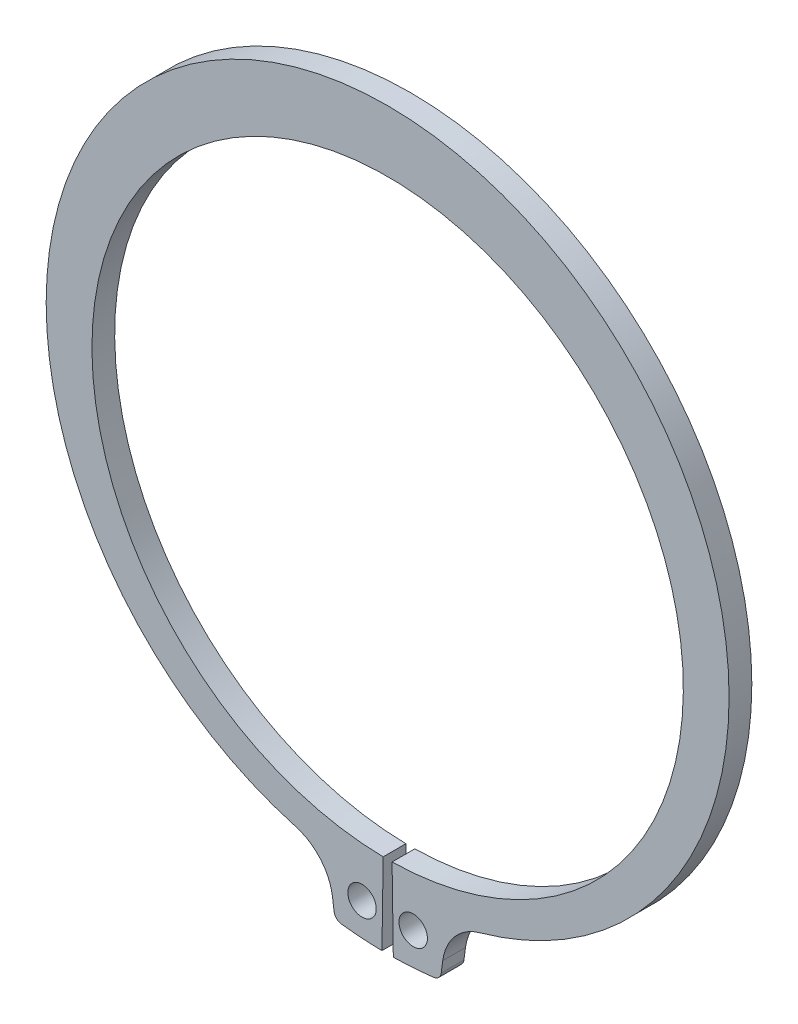
ISO-10303-21;
HEADER;
FILE_DESCRIPTION(('STEP AP214'),'2;1');
FILE_NAME('part.step','',(''),(''),'','','');
FILE_SCHEMA(('AUTOMOTIVE_DESIGN { 1 0 10303 214 1 1 1 1 }'));
ENDSEC;
DATA;
#1=APPLICATION_CONTEXT('core data for automotive mechanical design processes');
#2=APPLICATION_PROTOCOL_DEFINITION('international standard','automotive_design',2000,#1);
#3=PRODUCT_CONTEXT('',#1,'mechanical');
#4=PRODUCT('Part','Part','',(#3));
#5=PRODUCT_RELATED_PRODUCT_CATEGORY('part','',(#4));
#6=PRODUCT_DEFINITION_FORMATION('','',#4);
#7=PRODUCT_DEFINITION_CONTEXT('part definition',#1,'design');
#8=PRODUCT_DEFINITION('design','',#6,#7);
#9=PRODUCT_DEFINITION_SHAPE('','',#8);
#10=(LENGTH_UNIT() NAMED_UNIT(*) SI_UNIT(.MILLI.,.METRE.));
#11=(NAMED_UNIT(*) PLANE_ANGLE_UNIT() SI_UNIT($,.RADIAN.));
#12=(NAMED_UNIT(*) SI_UNIT($,.STERADIAN.) SOLID_ANGLE_UNIT());
#13=UNCERTAINTY_MEASURE_WITH_UNIT(LENGTH_MEASURE(1.E-05),#10,'distance_accuracy_value','');
#14=(GEOMETRIC_REPRESENTATION_CONTEXT(3) GLOBAL_UNCERTAINTY_ASSIGNED_CONTEXT((#13)) GLOBAL_UNIT_ASSIGNED_CONTEXT((#10,
#11,#12)) REPRESENTATION_CONTEXT('',''));
#15=CARTESIAN_POINT('',(0.,0.,0.));
#16=DIRECTION('',(0.,0.,1.));
#17=DIRECTION('',(1.,0.,0.));
#18=AXIS2_PLACEMENT_3D('',#15,#16,#17);
#19=CARTESIAN_POINT('',(0.,0.,-2.));
#20=DIRECTION('',(0.,0.,0.999999999999997));
#21=DIRECTION('',(0.999999999999999,0.,0.));
#22=AXIS2_PLACEMENT_3D('',#19,#20,#21);
#23=CYLINDRICAL_SURFACE('',#22,26.);
#24=CARTESIAN_POINT('',(0.,0.,0.));
#25=DIRECTION('',(0.,0.,-0.999999999999997));
#26=DIRECTION('',(0.999999999999999,0.,0.));
#27=AXIS2_PLACEMENT_3D('',#24,#25,#26);
#28=CIRCLE('',#27,26.);
#29=CARTESIAN_POINT('',(-0.391566265060234,-25.9970512916382,8.88178419700125E-13));
#30=VERTEX_POINT('',#29);
#31=CARTESIAN_POINT('',(0.391566265060234,-25.9970512916382,8.88178419700125E-13));
#32=VERTEX_POINT('',#31);
#33=EDGE_CURVE('E153',#30,#32,#28,.T.);
#34=ORIENTED_EDGE('',*,*,#33,.F.);
#35=DIRECTION('',(0.,0.,0.999999999999997));
#36=VECTOR('',#35,1.);
#37=CARTESIAN_POINT('',(-0.391566265060234,-25.9970512916382,-1.99999999999911));
#38=LINE('',#37,#36);
#39=CARTESIAN_POINT('',(-0.391566265060234,-25.9970512916382,-1.99999999999911));
#40=VERTEX_POINT('',#39);
#41=EDGE_CURVE('E11',#40,#30,#38,.T.);
#42=ORIENTED_EDGE('',*,*,#41,.F.);
#43=CARTESIAN_POINT('',(0.,0.,-2.));
#44=DIRECTION('',(0.,0.,-0.999999999999997));
#45=DIRECTION('',(0.999999999999999,0.,0.));
#46=AXIS2_PLACEMENT_3D('',#43,#44,#45);
#47=CIRCLE('',#46,26.);
#48=CARTESIAN_POINT('',(0.391566265060234,-25.9970512916382,-1.99999999999911));
#49=VERTEX_POINT('',#48);
#50=EDGE_CURVE('E186',#40,#49,#47,.T.);
#51=ORIENTED_EDGE('',*,*,#50,.T.);
#52=DIRECTION('',(0.,0.,0.999999999999997));
#53=VECTOR('',#52,1.);
#54=CARTESIAN_POINT('',(0.391566265060234,-25.9970512916382,-1.99999999999911));
#55=LINE('',#54,#53);
#56=EDGE_CURVE('E35',#49,#32,#55,.T.);
#57=ORIENTED_EDGE('',*,*,#56,.T.);
#58=EDGE_LOOP('',(#34,#42,#51,#57));
#59=FACE_BOUND('',#58,.T.);
#60=ADVANCED_FACE('F32',(#59),#23,.F.);
#61=CARTESIAN_POINT('',(-0.391566265060234,-25.9970512916382,-1.99999999999911));
#62=DIRECTION('',(0.999886588139929,-0.0150602409638554,0.));
#63=DIRECTION('',(0.0150602409638554,0.999886588139929,0.));
#64=AXIS2_PLACEMENT_3D('',#61,#62,#63);
#65=PLANE('',#64);
#66=DIRECTION('',(0.0150602409638556,0.999886588139929,0.));
#67=VECTOR('',#66,1.);
#68=CARTESIAN_POINT('',(-0.391566265060234,-25.9970512916382,8.88178419700125E-13));
#69=LINE('',#68,#67);
#70=CARTESIAN_POINT('',(-0.499999999999917,-33.1962347262457,8.88178419700125E-13));
#71=VERTEX_POINT('',#70);
#72=EDGE_CURVE('E184',#71,#30,#69,.T.);
#73=ORIENTED_EDGE('',*,*,#72,.F.);
#74=DIRECTION('',(0.,0.,0.999999999999997));
#75=VECTOR('',#74,1.);
#76=CARTESIAN_POINT('',(-0.499999999999973,-33.1962347262456,-1.99999999999911));
#77=LINE('',#76,#75);
#78=CARTESIAN_POINT('',(-0.499999999999973,-33.1962347262456,-1.99999999999911));
#79=VERTEX_POINT('',#78);
#80=EDGE_CURVE('E41',#79,#71,#77,.T.);
#81=ORIENTED_EDGE('',*,*,#80,.F.);
#82=DIRECTION('',(0.0150602409638556,0.999886588139929,0.));
#83=VECTOR('',#82,1.);
#84=CARTESIAN_POINT('',(-0.391566265060234,-25.9970512916382,-1.99999999999911));
#85=LINE('',#84,#83);
#86=EDGE_CURVE('E143',#79,#40,#85,.T.);
#87=ORIENTED_EDGE('',*,*,#86,.T.);
#88=ORIENTED_EDGE('',*,*,#41,.T.);
#89=EDGE_LOOP('',(#73,#81,#87,#88));
#90=FACE_BOUND('',#89,.T.);
#91=ADVANCED_FACE('F206',(#90),#65,.T.);
#92=CARTESIAN_POINT('',(0.,0.,-2.));
#93=DIRECTION('',(0.,0.,0.999999999999997));
#94=DIRECTION('',(0.999999999999999,0.,0.));
#95=AXIS2_PLACEMENT_3D('',#92,#93,#94);
#96=CYLINDRICAL_SURFACE('',#95,33.2);
#97=CARTESIAN_POINT('',(0.,0.,0.));
#98=DIRECTION('',(0.,0.,0.999999999999997));
#99=DIRECTION('',(0.999999999999999,0.,0.));
#100=AXIS2_PLACEMENT_3D('',#97,#98,#99);
#101=CIRCLE('',#100,33.2);
#102=CARTESIAN_POINT('',(-4.0594037367134,-32.9508913582373,8.88178419700125E-13));
#103=VERTEX_POINT('',#102);
#104=EDGE_CURVE('E130',#103,#71,#101,.T.);
#105=ORIENTED_EDGE('',*,*,#104,.F.);
#106=DIRECTION('',(0.,0.,0.999999999999997));
#107=VECTOR('',#106,1.);
#108=CARTESIAN_POINT('',(-4.0594037367134,-32.9508913582373,-1.99999999999911));
#109=LINE('',#108,#107);
#110=CARTESIAN_POINT('',(-4.0594037367134,-32.9508913582373,-1.99999999999911));
#111=VERTEX_POINT('',#110);
#112=EDGE_CURVE('E125',#111,#103,#109,.T.);
#113=ORIENTED_EDGE('',*,*,#112,.F.);
#114=CARTESIAN_POINT('',(0.,0.,-2.));
#115=DIRECTION('',(0.,0.,0.999999999999997));
#116=DIRECTION('',(0.999999999999999,0.,0.));
#117=AXIS2_PLACEMENT_3D('',#114,#115,#116);
#118=CIRCLE('',#117,33.2);
#119=EDGE_CURVE('E128',#111,#79,#118,.T.);
#120=ORIENTED_EDGE('',*,*,#119,.T.);
#121=ORIENTED_EDGE('',*,*,#80,.T.);
#122=EDGE_LOOP('',(#105,#113,#120,#121));
#123=FACE_BOUND('',#122,.T.);
#124=ADVANCED_FACE('F127',(#123),#96,.T.);
#125=CARTESIAN_POINT('',(-3.96770033904664,-32.206518812494,-1.99999999999911));
#126=DIRECTION('',(0.,0.,0.999999999999997));
#127=DIRECTION('',(0.999999999999999,0.,0.));
#128=AXIS2_PLACEMENT_3D('',#125,#126,#127);
#129=CYLINDRICAL_SURFACE('',#128,0.749999999999998);
#130=CARTESIAN_POINT('',(-3.96770033904661,-32.206518812494,8.88178419700125E-13));
#131=DIRECTION('',(0.,0.,0.999999999999997));
#132=DIRECTION('',(0.999999999999999,0.,0.));
#133=AXIS2_PLACEMENT_3D('',#130,#131,#132);
#134=CIRCLE('',#133,0.749999999999998);
#135=CARTESIAN_POINT('',(-4.71128398507695,-32.3044134566591,8.88178419700125E-13));
#136=VERTEX_POINT('',#135);
#137=EDGE_CURVE('E181',#136,#103,#134,.T.);
#138=ORIENTED_EDGE('',*,*,#137,.F.);
#139=DIRECTION('',(0.,0.,0.999999999999997));
#140=VECTOR('',#139,1.);
#141=CARTESIAN_POINT('',(-4.71128398507695,-32.3044134566591,-1.99999999999911));
#142=LINE('',#141,#140);
#143=CARTESIAN_POINT('',(-4.71128398507695,-32.3044134566591,-1.99999999999911));
#144=VERTEX_POINT('',#143);
#145=EDGE_CURVE('E135',#144,#136,#142,.T.);
#146=ORIENTED_EDGE('',*,*,#145,.F.);
#147=CARTESIAN_POINT('',(-3.96770033904664,-32.206518812494,-1.99999999999911));
#148=DIRECTION('',(0.,0.,0.999999999999997));
#149=DIRECTION('',(0.999999999999999,0.,0.));
#150=AXIS2_PLACEMENT_3D('',#147,#148,#149);
#151=CIRCLE('',#150,0.749999999999998);
#152=EDGE_CURVE('E141',#144,#111,#151,.T.);
#153=ORIENTED_EDGE('',*,*,#152,.T.);
#154=ORIENTED_EDGE('',*,*,#112,.T.);
#155=EDGE_LOOP('',(#138,#146,#153,#154));
#156=FACE_BOUND('',#155,.T.);
#157=ADVANCED_FACE('F145',(#156),#129,.T.);
#158=CARTESIAN_POINT('',(-4.84596341626201,-31.2814216133361,-1.99999999999911));
#159=DIRECTION('',(-0.991444861373809,-0.130526192220058,0.));
#160=DIRECTION('',(0.130526192220058,-0.991444861373809,0.));
#161=AXIS2_PLACEMENT_3D('',#158,#159,#160);
#162=PLANE('',#161);
#163=DIRECTION('',(0.130526192220058,-0.991444861373808,0.));
#164=VECTOR('',#163,1.);
#165=CARTESIAN_POINT('',(-4.84596341626201,-31.2814216133361,8.88178419700125E-13));
#166=LINE('',#165,#164);
#167=CARTESIAN_POINT('',(-4.84596341626201,-31.2814216133361,8.88178419700125E-13));
#168=VERTEX_POINT('',#167);
#169=EDGE_CURVE('E178',#168,#136,#166,.T.);
#170=ORIENTED_EDGE('',*,*,#169,.F.);
#171=DIRECTION('',(0.,0.,0.999999999999997));
#172=VECTOR('',#171,1.);
#173=CARTESIAN_POINT('',(-4.84596341626201,-31.2814216133361,-1.99999999999911));
#174=LINE('',#173,#172);
#175=CARTESIAN_POINT('',(-4.84596341626201,-31.2814216133361,-1.99999999999911));
#176=VERTEX_POINT('',#175);
#177=EDGE_CURVE('E190',#176,#168,#174,.T.);
#178=ORIENTED_EDGE('',*,*,#177,.F.);
#179=DIRECTION('',(0.130526192220058,-0.991444861373808,0.));
#180=VECTOR('',#179,1.);
#181=CARTESIAN_POINT('',(-4.84596341626201,-31.2814216133361,-1.99999999999911));
#182=LINE('',#181,#180);
#183=EDGE_CURVE('E146',#176,#144,#182,.T.);
#184=ORIENTED_EDGE('',*,*,#183,.T.);
#185=ORIENTED_EDGE('',*,*,#145,.T.);
#186=EDGE_LOOP('',(#170,#178,#184,#185));
#187=FACE_BOUND('',#186,.T.);
#188=ADVANCED_FACE('F219',(#187),#162,.T.);
#189=CARTESIAN_POINT('',(-9.3071448805776,-31.8687472953039,-1.99999999999911));
#190=DIRECTION('',(0.,0.,0.999999999999997));
#191=DIRECTION('',(0.999999999999999,0.,0.));
#192=AXIS2_PLACEMENT_3D('',#189,#190,#191);
#193=CYLINDRICAL_SURFACE('',#192,4.49967682331209);
#194=CARTESIAN_POINT('',(-9.3071448805776,-31.8687472953039,8.88178419700125E-13));
#195=DIRECTION('',(0.,0.,-0.999999999999997));
#196=DIRECTION('',(0.999999999999999,0.,0.));
#197=AXIS2_PLACEMENT_3D('',#194,#195,#196);
#198=CIRCLE('',#197,4.49967682331209);
#199=CARTESIAN_POINT('',(-8.09407667928527,-27.5356702069906,8.88178419700125E-13));
#200=VERTEX_POINT('',#199);
#201=EDGE_CURVE('E175',#200,#168,#198,.T.);
#202=ORIENTED_EDGE('',*,*,#201,.F.);
#203=DIRECTION('',(0.,0.,0.999999999999997));
#204=VECTOR('',#203,1.);
#205=CARTESIAN_POINT('',(-8.09407667928527,-27.5356702069906,-1.99999999999911));
#206=LINE('',#205,#204);
#207=CARTESIAN_POINT('',(-8.09407667928527,-27.5356702069906,-1.99999999999911));
#208=VERTEX_POINT('',#207);
#209=EDGE_CURVE('E192',#208,#200,#206,.T.);
#210=ORIENTED_EDGE('',*,*,#209,.F.);
#211=CARTESIAN_POINT('',(-9.3071448805776,-31.8687472953039,-1.99999999999911));
#212=DIRECTION('',(0.,0.,-0.999999999999997));
#213=DIRECTION('',(0.999999999999999,0.,0.));
#214=AXIS2_PLACEMENT_3D('',#211,#212,#213);
#215=CIRCLE('',#214,4.49967682331209);
#216=EDGE_CURVE('E148',#208,#176,#215,.T.);
#217=ORIENTED_EDGE('',*,*,#216,.T.);
#218=ORIENTED_EDGE('',*,*,#177,.T.);
#219=EDGE_LOOP('',(#202,#210,#217,#218));
#220=FACE_BOUND('',#219,.T.);
#221=ADVANCED_FACE('F222',(#220),#193,.F.);
#222=CARTESIAN_POINT('',(0.,1.37635483224265,-2.));
#223=DIRECTION('',(0.,0.,0.999999999999997));
#224=DIRECTION('',(0.999999999999999,0.,0.));
#225=AXIS2_PLACEMENT_3D('',#222,#223,#224);
#226=CYLINDRICAL_SURFACE('',#225,30.0236451677574);
#227=CARTESIAN_POINT('',(0.,1.37635483224262,0.));
#228=DIRECTION('',(0.,0.,0.999999999999997));
#229=DIRECTION('',(0.999999999999999,0.,0.));
#230=AXIS2_PLACEMENT_3D('',#227,#228,#229);
#231=CIRCLE('',#230,30.0236451677574);
#232=CARTESIAN_POINT('',(8.09407667928527,-27.5356702069906,6.66133814775094E-13));
#233=VERTEX_POINT('',#232);
#234=EDGE_CURVE('E172',#233,#200,#231,.T.);
#235=ORIENTED_EDGE('',*,*,#234,.F.);
#236=DIRECTION('',(0.,0.,0.999999999999997));
#237=VECTOR('',#236,1.);
#238=CARTESIAN_POINT('',(8.09407667928527,-27.5356702069906,-1.99999999999911));
#239=LINE('',#238,#237);
#240=CARTESIAN_POINT('',(8.09407667928527,-27.5356702069906,-1.99999999999911));
#241=VERTEX_POINT('',#240);
#242=EDGE_CURVE('E194',#241,#233,#239,.T.);
#243=ORIENTED_EDGE('',*,*,#242,.F.);
#244=CARTESIAN_POINT('',(0.,1.37635483224265,-2.));
#245=DIRECTION('',(0.,0.,0.999999999999997));
#246=DIRECTION('',(0.999999999999999,0.,0.));
#247=AXIS2_PLACEMENT_3D('',#244,#245,#246);
#248=CIRCLE('',#247,30.0236451677574);
#249=EDGE_CURVE('E296',#241,#208,#248,.T.);
#250=ORIENTED_EDGE('',*,*,#249,.T.);
#251=ORIENTED_EDGE('',*,*,#209,.T.);
#252=EDGE_LOOP('',(#235,#243,#250,#251));
#253=FACE_BOUND('',#252,.T.);
#254=ADVANCED_FACE('F226',(#253),#226,.T.);
#255=CARTESIAN_POINT('',(9.3071448805776,-31.8687472953039,-1.99999999999934));
#256=DIRECTION('',(0.,0.,0.999999999999997));
#257=DIRECTION('',(0.999999999999999,0.,0.));
#258=AXIS2_PLACEMENT_3D('',#255,#256,#257);
#259=CYLINDRICAL_SURFACE('',#258,4.49967682331209);
#260=CARTESIAN_POINT('',(9.30714488057768,-31.8687472953039,6.66133814775094E-13));
#261=DIRECTION('',(0.,0.,-0.999999999999997));
#262=DIRECTION('',(0.999999999999999,0.,0.));
#263=AXIS2_PLACEMENT_3D('',#260,#261,#262);
#264=CIRCLE('',#263,4.49967682331209);
#265=CARTESIAN_POINT('',(4.84596341626201,-31.2814216133361,6.66133814775094E-13));
#266=VERTEX_POINT('',#265);
#267=EDGE_CURVE('E169',#266,#233,#264,.T.);
#268=ORIENTED_EDGE('',*,*,#267,.F.);
#269=DIRECTION('',(0.,0.,0.999999999999997));
#270=VECTOR('',#269,1.);
#271=CARTESIAN_POINT('',(4.84596341626201,-31.2814216133361,-1.99999999999911));
#272=LINE('',#271,#270);
#273=CARTESIAN_POINT('',(4.84596341626201,-31.2814216133361,-1.99999999999911));
#274=VERTEX_POINT('',#273);
#275=EDGE_CURVE('E196',#274,#266,#272,.T.);
#276=ORIENTED_EDGE('',*,*,#275,.F.);
#277=CARTESIAN_POINT('',(9.3071448805776,-31.8687472953039,-1.99999999999934));
#278=DIRECTION('',(0.,0.,-0.999999999999997));
#279=DIRECTION('',(0.999999999999999,0.,0.));
#280=AXIS2_PLACEMENT_3D('',#277,#278,#279);
#281=CIRCLE('',#280,4.49967682331209);
#282=EDGE_CURVE('E293',#274,#241,#281,.T.);
#283=ORIENTED_EDGE('',*,*,#282,.T.);
#284=ORIENTED_EDGE('',*,*,#242,.T.);
#285=EDGE_LOOP('',(#268,#276,#283,#284));
#286=FACE_BOUND('',#285,.T.);
#287=ADVANCED_FACE('F230',(#286),#259,.F.);
#288=CARTESIAN_POINT('',(4.84596341626201,-31.2814216133361,-1.99999999999911));
#289=DIRECTION('',(0.99144486137381,-0.13052619222005,0.));
#290=DIRECTION('',(0.13052619222005,0.99144486137381,0.));
#291=AXIS2_PLACEMENT_3D('',#288,#289,#290);
#292=PLANE('',#291);
#293=DIRECTION('',(0.13052619222005,0.99144486137381,0.));
#294=VECTOR('',#293,1.);
#295=CARTESIAN_POINT('',(4.84596341626201,-31.2814216133361,6.66133814775094E-13));
#296=LINE('',#295,#294);
#297=CARTESIAN_POINT('',(4.71128398507711,-32.3044134566591,6.66133814775094E-13));
#298=VERTEX_POINT('',#297);
#299=EDGE_CURVE('E166',#298,#266,#296,.T.);
#300=ORIENTED_EDGE('',*,*,#299,.F.);
#301=DIRECTION('',(0.,0.,0.999999999999997));
#302=VECTOR('',#301,1.);
#303=CARTESIAN_POINT('',(4.71128398507706,-32.304413456659,-1.99999999999934));
#304=LINE('',#303,#302);
#305=CARTESIAN_POINT('',(4.71128398507706,-32.304413456659,-1.99999999999934));
#306=VERTEX_POINT('',#305);
#307=EDGE_CURVE('E198',#306,#298,#304,.T.);
#308=ORIENTED_EDGE('',*,*,#307,.F.);
#309=DIRECTION('',(0.13052619222005,0.99144486137381,0.));
#310=VECTOR('',#309,1.);
#311=CARTESIAN_POINT('',(4.84596341626201,-31.2814216133361,-1.99999999999911));
#312=LINE('',#311,#310);
#313=EDGE_CURVE('E290',#306,#274,#312,.T.);
#314=ORIENTED_EDGE('',*,*,#313,.T.);
#315=ORIENTED_EDGE('',*,*,#275,.T.);
#316=EDGE_LOOP('',(#300,#308,#314,#315));
#317=FACE_BOUND('',#316,.T.);
#318=ADVANCED_FACE('F234',(#317),#292,.T.);
#319=CARTESIAN_POINT('',(3.96770033904667,-32.206518812494,-1.99999999999911));
#320=DIRECTION('',(0.,0.,0.999999999999997));
#321=DIRECTION('',(0.999999999999999,0.,0.));
#322=AXIS2_PLACEMENT_3D('',#319,#320,#321);
#323=CYLINDRICAL_SURFACE('',#322,0.749999999999998);
#324=CARTESIAN_POINT('',(3.96770033904667,-32.206518812494,6.66133814775094E-13));
#325=DIRECTION('',(0.,0.,0.999999999999997));
#326=DIRECTION('',(-0.999999999999999,0.,0.));
#327=AXIS2_PLACEMENT_3D('',#324,#325,#326);
#328=CIRCLE('',#327,0.749999999999998);
#329=CARTESIAN_POINT('',(4.05940373671346,-32.9508913582373,6.66133814775094E-13));
#330=VERTEX_POINT('',#329);
#331=EDGE_CURVE('E163',#330,#298,#328,.T.);
#332=ORIENTED_EDGE('',*,*,#331,.F.);
#333=DIRECTION('',(0.,0.,0.999999999999997));
#334=VECTOR('',#333,1.);
#335=CARTESIAN_POINT('',(4.05940373671346,-32.9508913582373,-1.99999999999934));
#336=LINE('',#335,#334);
#337=CARTESIAN_POINT('',(4.05940373671346,-32.9508913582373,-1.99999999999934));
#338=VERTEX_POINT('',#337);
#339=EDGE_CURVE('E200',#338,#330,#336,.T.);
#340=ORIENTED_EDGE('',*,*,#339,.F.);
#341=CARTESIAN_POINT('',(3.96770033904667,-32.206518812494,-1.99999999999911));
#342=DIRECTION('',(0.,0.,0.999999999999997));
#343=DIRECTION('',(-0.999999999999999,0.,0.));
#344=AXIS2_PLACEMENT_3D('',#341,#342,#343);
#345=CIRCLE('',#344,0.749999999999998);
#346=EDGE_CURVE('E287',#338,#306,#345,.T.);
#347=ORIENTED_EDGE('',*,*,#346,.T.);
#348=ORIENTED_EDGE('',*,*,#307,.T.);
#349=EDGE_LOOP('',(#332,#340,#347,#348));
#350=FACE_BOUND('',#349,.T.);
#351=ADVANCED_FACE('F238',(#350),#323,.T.);
#352=CARTESIAN_POINT('',(0.,0.,-2.));
#353=DIRECTION('',(0.,0.,0.999999999999997));
#354=DIRECTION('',(0.999999999999999,0.,0.));
#355=AXIS2_PLACEMENT_3D('',#352,#353,#354);
#356=CYLINDRICAL_SURFACE('',#355,33.2);
#357=CARTESIAN_POINT('',(0.,0.,0.));
#358=DIRECTION('',(0.,0.,0.999999999999997));
#359=DIRECTION('',(0.999999999999999,0.,0.));
#360=AXIS2_PLACEMENT_3D('',#357,#358,#359);
#361=CIRCLE('',#360,33.2);
#362=CARTESIAN_POINT('',(0.500000000000028,-33.1962347262457,8.88178419700125E-13));
#363=VERTEX_POINT('',#362);
#364=EDGE_CURVE('E160',#363,#330,#361,.T.);
#365=ORIENTED_EDGE('',*,*,#364,.F.);
#366=DIRECTION('',(0.,0.,0.999999999999997));
#367=VECTOR('',#366,1.);
#368=CARTESIAN_POINT('',(0.500000000000028,-33.1962347262457,-1.99999999999911));
#369=LINE('',#368,#367);
#370=CARTESIAN_POINT('',(0.500000000000028,-33.1962347262457,-1.99999999999911));
#371=VERTEX_POINT('',#370);
#372=EDGE_CURVE('E201',#371,#363,#369,.T.);
#373=ORIENTED_EDGE('',*,*,#372,.F.);
#374=CARTESIAN_POINT('',(0.,0.,-2.));
#375=DIRECTION('',(0.,0.,0.999999999999997));
#376=DIRECTION('',(0.999999999999999,0.,0.));
#377=AXIS2_PLACEMENT_3D('',#374,#375,#376);
#378=CIRCLE('',#377,33.2);
#379=EDGE_CURVE('E284',#371,#338,#378,.T.);
#380=ORIENTED_EDGE('',*,*,#379,.T.);
#381=ORIENTED_EDGE('',*,*,#339,.T.);
#382=EDGE_LOOP('',(#365,#373,#380,#381));
#383=FACE_BOUND('',#382,.T.);
#384=ADVANCED_FACE('F242',(#383),#356,.T.);
#385=CARTESIAN_POINT('',(0.391566265060234,-25.9970512916382,-1.99999999999911));
#386=DIRECTION('',(-0.99988658813993,-0.0150602409638554,0.));
#387=DIRECTION('',(0.0150602409638554,-0.99988658813993,0.));
#388=AXIS2_PLACEMENT_3D('',#385,#386,#387);
#389=PLANE('',#388);
#390=DIRECTION('',(0.0150602409638552,-0.999886588139929,0.));
#391=VECTOR('',#390,1.);
#392=CARTESIAN_POINT('',(0.391566265060234,-25.9970512916382,8.88178419700125E-13));
#393=LINE('',#392,#391);
#394=EDGE_CURVE('E156',#32,#363,#393,.T.);
#395=ORIENTED_EDGE('',*,*,#394,.F.);
#396=ORIENTED_EDGE('',*,*,#56,.F.);
#397=DIRECTION('',(0.0150602409638552,-0.999886588139929,0.));
#398=VECTOR('',#397,1.);
#399=CARTESIAN_POINT('',(0.391566265060234,-25.9970512916382,-1.99999999999911));
#400=LINE('',#399,#398);
#401=EDGE_CURVE('E282',#49,#371,#400,.T.);
#402=ORIENTED_EDGE('',*,*,#401,.T.);
#403=ORIENTED_EDGE('',*,*,#372,.T.);
#404=EDGE_LOOP('',(#395,#396,#402,#403));
#405=FACE_BOUND('',#404,.T.);
#406=ADVANCED_FACE('F203',(#405),#389,.T.);
#407=CARTESIAN_POINT('',(0.,0.,-2.));
#408=DIRECTION('',(0.,0.,0.999999999999997));
#409=DIRECTION('',(0.999999999999999,0.,0.));
#410=AXIS2_PLACEMENT_3D('',#407,#408,#409);
#411=PLANE('',#410);
#412=CARTESIAN_POINT('',(-2.25,-30.2664831125124,-1.99999999999911));
#413=DIRECTION('',(0.,0.,0.999999999999997));
#414=DIRECTION('',(0.999999999999999,0.,0.));
#415=AXIS2_PLACEMENT_3D('',#412,#413,#414);
#416=CIRCLE('',#415,1.25);
#417=CARTESIAN_POINT('',(-1.,-30.2664831125124,-1.99999999999911));
#418=VERTEX_POINT('',#417);
#419=EDGE_CURVE('E269',#418,#418,#416,.T.);
#420=ORIENTED_EDGE('',*,*,#419,.T.);
#421=EDGE_LOOP('',(#420));
#422=FACE_BOUND('',#421,.T.);
#423=CARTESIAN_POINT('',(2.25,-30.2664831125124,-1.99999999999911));
#424=DIRECTION('',(0.,0.,0.999999999999997));
#425=DIRECTION('',(0.999999999999999,0.,0.));
#426=AXIS2_PLACEMENT_3D('',#423,#424,#425);
#427=CIRCLE('',#426,1.25);
#428=CARTESIAN_POINT('',(3.5,-30.2664831125124,-1.99999999999911));
#429=VERTEX_POINT('',#428);
#430=EDGE_CURVE('E157',#429,#429,#427,.T.);
#431=ORIENTED_EDGE('',*,*,#430,.T.);
#432=EDGE_LOOP('',(#431));
#433=FACE_BOUND('',#432,.T.);
#434=ORIENTED_EDGE('',*,*,#50,.F.);
#435=ORIENTED_EDGE('',*,*,#86,.F.);
#436=ORIENTED_EDGE('',*,*,#119,.F.);
#437=ORIENTED_EDGE('',*,*,#152,.F.);
#438=ORIENTED_EDGE('',*,*,#183,.F.);
#439=ORIENTED_EDGE('',*,*,#216,.F.);
#440=ORIENTED_EDGE('',*,*,#249,.F.);
#441=ORIENTED_EDGE('',*,*,#282,.F.);
#442=ORIENTED_EDGE('',*,*,#313,.F.);
#443=ORIENTED_EDGE('',*,*,#346,.F.);
#444=ORIENTED_EDGE('',*,*,#379,.F.);
#445=ORIENTED_EDGE('',*,*,#401,.F.);
#446=EDGE_LOOP('',(#434,#435,#436,#437,#438,#439,#440,#441,#442,#443,#444,#445));
#447=FACE_BOUND('',#446,.T.);
#448=ADVANCED_FACE('F139',(#422,#433,#447),#411,.F.);
#449=CARTESIAN_POINT('',(0.,0.,0.));
#450=DIRECTION('',(0.,0.,0.999999999999997));
#451=DIRECTION('',(0.999999999999999,0.,0.));
#452=AXIS2_PLACEMENT_3D('',#449,#450,#451);
#453=PLANE('',#452);
#454=CARTESIAN_POINT('',(-2.25,-30.2664831125124,8.88178419700125E-13));
#455=DIRECTION('',(0.,0.,0.999999999999997));
#456=DIRECTION('',(0.999999999999999,0.,0.));
#457=AXIS2_PLACEMENT_3D('',#454,#455,#456);
#458=CIRCLE('',#457,1.25);
#459=CARTESIAN_POINT('',(-1.,-30.2664831125124,8.88178419700125E-13));
#460=VERTEX_POINT('',#459);
#461=EDGE_CURVE('E272',#460,#460,#458,.T.);
#462=ORIENTED_EDGE('',*,*,#461,.F.);
#463=EDGE_LOOP('',(#462));
#464=FACE_BOUND('',#463,.T.);
#465=CARTESIAN_POINT('',(2.25,-30.2664831125124,8.88178419700125E-13));
#466=DIRECTION('',(0.,0.,0.999999999999997));
#467=DIRECTION('',(0.999999999999999,0.,0.));
#468=AXIS2_PLACEMENT_3D('',#465,#466,#467);
#469=CIRCLE('',#468,1.25);
#470=CARTESIAN_POINT('',(3.5,-30.2664831125124,8.88178419700125E-13));
#471=VERTEX_POINT('',#470);
#472=EDGE_CURVE('E274',#471,#471,#469,.T.);
#473=ORIENTED_EDGE('',*,*,#472,.F.);
#474=EDGE_LOOP('',(#473));
#475=FACE_BOUND('',#474,.T.);
#476=ORIENTED_EDGE('',*,*,#33,.T.);
#477=ORIENTED_EDGE('',*,*,#394,.T.);
#478=ORIENTED_EDGE('',*,*,#364,.T.);
#479=ORIENTED_EDGE('',*,*,#331,.T.);
#480=ORIENTED_EDGE('',*,*,#299,.T.);
#481=ORIENTED_EDGE('',*,*,#267,.T.);
#482=ORIENTED_EDGE('',*,*,#234,.T.);
#483=ORIENTED_EDGE('',*,*,#201,.T.);
#484=ORIENTED_EDGE('',*,*,#169,.T.);
#485=ORIENTED_EDGE('',*,*,#137,.T.);
#486=ORIENTED_EDGE('',*,*,#104,.T.);
#487=ORIENTED_EDGE('',*,*,#72,.T.);
#488=EDGE_LOOP('',(#476,#477,#478,#479,#480,#481,#482,#483,#484,#485,#486,#487));
#489=FACE_BOUND('',#488,.T.);
#490=ADVANCED_FACE('F205',(#464,#475,#489),#453,.T.);
#491=CARTESIAN_POINT('',(2.25,-30.2664831125124,-1.99999999999911));
#492=DIRECTION('',(0.,0.,0.999999999999997));
#493=DIRECTION('',(0.999999999999999,0.,0.));
#494=AXIS2_PLACEMENT_3D('',#491,#492,#493);
#495=CYLINDRICAL_SURFACE('',#494,1.25);
#496=CARTESIAN_POINT('',(3.5,-30.2664831125124,-1.99999999999911));
#497=CARTESIAN_POINT('',(3.5,-30.2664831125124,-1.97916666666578));
#498=CARTESIAN_POINT('',(3.5,-30.2664831125124,-1.95833333333245));
#499=CARTESIAN_POINT('',(3.5,-30.2664831125124,-1.91666666666578));
#500=CARTESIAN_POINT('',(3.5,-30.2664831125124,-1.89583333333245));
#501=CARTESIAN_POINT('',(3.5,-30.2664831125124,-1.85416666666578));
#502=CARTESIAN_POINT('',(3.5,-30.2664831125124,-1.83333333333245));
#503=CARTESIAN_POINT('',(3.5,-30.2664831125124,-1.79166666666578));
#504=CARTESIAN_POINT('',(3.5,-30.2664831125124,-1.77083333333245));
#505=CARTESIAN_POINT('',(3.5,-30.2664831125124,-1.72916666666578));
#506=CARTESIAN_POINT('',(3.5,-30.2664831125124,-1.70833333333245));
#507=CARTESIAN_POINT('',(3.5,-30.2664831125124,-1.66666666666578));
#508=CARTESIAN_POINT('',(3.5,-30.2664831125124,-1.64583333333245));
#509=CARTESIAN_POINT('',(3.5,-30.2664831125124,-1.60416666666578));
#510=CARTESIAN_POINT('',(3.5,-30.2664831125124,-1.58333333333245));
#511=CARTESIAN_POINT('',(3.5,-30.2664831125124,-1.54166666666578));
#512=CARTESIAN_POINT('',(3.5,-30.2664831125124,-1.52083333333245));
#513=CARTESIAN_POINT('',(3.5,-30.2664831125124,-1.47916666666578));
#514=CARTESIAN_POINT('',(3.5,-30.2664831125124,-1.45833333333245));
#515=CARTESIAN_POINT('',(3.5,-30.2664831125124,-1.41666666666578));
#516=CARTESIAN_POINT('',(3.5,-30.2664831125124,-1.39583333333245));
#517=CARTESIAN_POINT('',(3.5,-30.2664831125124,-1.35416666666578));
#518=CARTESIAN_POINT('',(3.5,-30.2664831125124,-1.33333333333245));
#519=CARTESIAN_POINT('',(3.5,-30.2664831125124,-1.29166666666578));
#520=CARTESIAN_POINT('',(3.5,-30.2664831125124,-1.27083333333245));
#521=CARTESIAN_POINT('',(3.5,-30.2664831125124,-1.22916666666578));
#522=CARTESIAN_POINT('',(3.5,-30.2664831125124,-1.20833333333245));
#523=CARTESIAN_POINT('',(3.5,-30.2664831125124,-1.16666666666578));
#524=CARTESIAN_POINT('',(3.5,-30.2664831125124,-1.14583333333245));
#525=CARTESIAN_POINT('',(3.5,-30.2664831125124,-1.10416666666578));
#526=CARTESIAN_POINT('',(3.5,-30.2664831125124,-1.08333333333245));
#527=CARTESIAN_POINT('',(3.5,-30.2664831125124,-1.04166666666578));
#528=CARTESIAN_POINT('',(3.5,-30.2664831125124,-1.02083333333245));
#529=CARTESIAN_POINT('',(3.5,-30.2664831125124,-0.979166666665779));
#530=CARTESIAN_POINT('',(3.5,-30.2664831125124,-0.958333333332446));
#531=CARTESIAN_POINT('',(3.5,-30.2664831125124,-0.91666666666578));
#532=CARTESIAN_POINT('',(3.5,-30.2664831125124,-0.895833333332446));
#533=CARTESIAN_POINT('',(3.5,-30.2664831125124,-0.854166666665779));
#534=CARTESIAN_POINT('',(3.5,-30.2664831125124,-0.833333333332446));
#535=CARTESIAN_POINT('',(3.5,-30.2664831125124,-0.79166666666578));
#536=CARTESIAN_POINT('',(3.5,-30.2664831125124,-0.770833333332446));
#537=CARTESIAN_POINT('',(3.5,-30.2664831125124,-0.729166666665779));
#538=CARTESIAN_POINT('',(3.5,-30.2664831125124,-0.708333333332446));
#539=CARTESIAN_POINT('',(3.5,-30.2664831125124,-0.666666666665779));
#540=CARTESIAN_POINT('',(3.5,-30.2664831125124,-0.645833333332446));
#541=CARTESIAN_POINT('',(3.5,-30.2664831125124,-0.604166666665779));
#542=CARTESIAN_POINT('',(3.5,-30.2664831125124,-0.583333333332446));
#543=CARTESIAN_POINT('',(3.5,-30.2664831125124,-0.541666666665779));
#544=CARTESIAN_POINT('',(3.5,-30.2664831125124,-0.520833333332446));
#545=CARTESIAN_POINT('',(3.5,-30.2664831125124,-0.479166666665779));
#546=CARTESIAN_POINT('',(3.5,-30.2664831125124,-0.458333333332446));
#547=CARTESIAN_POINT('',(3.5,-30.2664831125124,-0.416666666665779));
#548=CARTESIAN_POINT('',(3.5,-30.2664831125124,-0.395833333332446));
#549=CARTESIAN_POINT('',(3.5,-30.2664831125124,-0.354166666665779));
#550=CARTESIAN_POINT('',(3.5,-30.2664831125124,-0.333333333332446));
#551=CARTESIAN_POINT('',(3.5,-30.2664831125124,-0.291666666665779));
#552=CARTESIAN_POINT('',(3.5,-30.2664831125124,-0.270833333332446));
#553=CARTESIAN_POINT('',(3.5,-30.2664831125124,-0.229166666665779));
#554=CARTESIAN_POINT('',(3.5,-30.2664831125124,-0.208333333332446));
#555=CARTESIAN_POINT('',(3.5,-30.2664831125124,-0.166666666665779));
#556=CARTESIAN_POINT('',(3.5,-30.2664831125124,-0.145833333332446));
#557=CARTESIAN_POINT('',(3.5,-30.2664831125124,-0.104166666665779));
#558=CARTESIAN_POINT('',(3.5,-30.2664831125124,-0.0833333333324456));
#559=CARTESIAN_POINT('',(3.5,-30.2664831125124,-0.0416666666657788));
#560=CARTESIAN_POINT('',(3.5,-30.2664831125124,-0.0208333333324453));
#561=CARTESIAN_POINT('',(3.5,-30.2664831125124,8.88178419700125E-13));
#562=B_SPLINE_CURVE_WITH_KNOTS('',3,(#496,#497,#498,#499,#500,#501,#502,#503,#504,#505,#506,
#507,#508,#509,#510,#511,#512,#513,#514,#515,#516,#517,#518,#519,#520,#521,#522,#523,#524,#525,
#526,#527,#528,#529,#530,#531,#532,#533,#534,#535,#536,#537,#538,#539,#540,#541,#542,#543,#544,
#545,#546,#547,#548,#549,#550,#551,#552,#553,#554,#555,#556,#557,#558,#559,#560,#561),
.UNSPECIFIED.,.F.,.F.,(4,2,2,2,2,2,2,2,2,2,2,2,2,2,2,2,2,2,2,2,2,2,2,2,2,2,2,2,2,2,2,2,4),(0.,
0.0624999999999998,0.125,0.1875,0.25,0.3125,0.375,0.4375,0.5,0.5625,0.625,0.6875,0.75,
0.812500000000001,0.875,0.9375,1.,1.0625,1.125,1.1875,1.25,1.3125,1.375,1.4375,1.5,1.5625,1.625,
1.6875,1.75,1.8125,1.875,1.9375,2.),.UNSPECIFIED.);
#563=EDGE_CURVE('BSEAM254',#429,#471,#562,.T.);
#564=ORIENTED_EDGE('',*,*,#430,.F.);
#565=ORIENTED_EDGE('',*,*,#472,.T.);
#566=ORIENTED_EDGE('',*,*,#563,.T.);
#567=ORIENTED_EDGE('',*,*,#563,.F.);
#568=EDGE_LOOP('',(#564,#566,#565,#567));
#569=FACE_BOUND('',#568,.T.);
#570=ADVANCED_FACE('F254',(#569),#495,.F.);
#571=CARTESIAN_POINT('',(-2.25,-30.2664831125124,-1.99999999999911));
#572=DIRECTION('',(0.,0.,0.999999999999997));
#573=DIRECTION('',(0.999999999999999,0.,0.));
#574=AXIS2_PLACEMENT_3D('',#571,#572,#573);
#575=CYLINDRICAL_SURFACE('',#574,1.25);
#576=CARTESIAN_POINT('',(-1.,-30.2664831125124,-1.99999999999911));
#577=CARTESIAN_POINT('',(-1.,-30.2664831125124,-1.97916666666578));
#578=CARTESIAN_POINT('',(-1.,-30.2664831125124,-1.95833333333245));
#579=CARTESIAN_POINT('',(-1.,-30.2664831125124,-1.91666666666578));
#580=CARTESIAN_POINT('',(-1.,-30.2664831125124,-1.89583333333245));
#581=CARTESIAN_POINT('',(-1.,-30.2664831125124,-1.85416666666578));
#582=CARTESIAN_POINT('',(-1.,-30.2664831125124,-1.83333333333245));
#583=CARTESIAN_POINT('',(-1.,-30.2664831125124,-1.79166666666578));
#584=CARTESIAN_POINT('',(-1.,-30.2664831125124,-1.77083333333245));
#585=CARTESIAN_POINT('',(-1.,-30.2664831125124,-1.72916666666578));
#586=CARTESIAN_POINT('',(-1.,-30.2664831125124,-1.70833333333245));
#587=CARTESIAN_POINT('',(-1.,-30.2664831125124,-1.66666666666578));
#588=CARTESIAN_POINT('',(-1.,-30.2664831125124,-1.64583333333245));
#589=CARTESIAN_POINT('',(-1.,-30.2664831125124,-1.60416666666578));
#590=CARTESIAN_POINT('',(-1.,-30.2664831125124,-1.58333333333245));
#591=CARTESIAN_POINT('',(-1.,-30.2664831125124,-1.54166666666578));
#592=CARTESIAN_POINT('',(-1.,-30.2664831125124,-1.52083333333245));
#593=CARTESIAN_POINT('',(-1.,-30.2664831125124,-1.47916666666578));
#594=CARTESIAN_POINT('',(-1.,-30.2664831125124,-1.45833333333245));
#595=CARTESIAN_POINT('',(-1.,-30.2664831125124,-1.41666666666578));
#596=CARTESIAN_POINT('',(-1.,-30.2664831125124,-1.39583333333245));
#597=CARTESIAN_POINT('',(-1.,-30.2664831125124,-1.35416666666578));
#598=CARTESIAN_POINT('',(-1.,-30.2664831125124,-1.33333333333245));
#599=CARTESIAN_POINT('',(-1.,-30.2664831125124,-1.29166666666578));
#600=CARTESIAN_POINT('',(-1.,-30.2664831125124,-1.27083333333245));
#601=CARTESIAN_POINT('',(-1.,-30.2664831125124,-1.22916666666578));
#602=CARTESIAN_POINT('',(-1.,-30.2664831125124,-1.20833333333245));
#603=CARTESIAN_POINT('',(-1.,-30.2664831125124,-1.16666666666578));
#604=CARTESIAN_POINT('',(-1.,-30.2664831125124,-1.14583333333245));
#605=CARTESIAN_POINT('',(-1.,-30.2664831125124,-1.10416666666578));
#606=CARTESIAN_POINT('',(-1.,-30.2664831125124,-1.08333333333245));
#607=CARTESIAN_POINT('',(-1.,-30.2664831125124,-1.04166666666578));
#608=CARTESIAN_POINT('',(-1.,-30.2664831125124,-1.02083333333245));
#609=CARTESIAN_POINT('',(-1.,-30.2664831125124,-0.979166666665779));
#610=CARTESIAN_POINT('',(-1.,-30.2664831125124,-0.958333333332446));
#611=CARTESIAN_POINT('',(-1.,-30.2664831125124,-0.91666666666578));
#612=CARTESIAN_POINT('',(-1.,-30.2664831125124,-0.895833333332446));
#613=CARTESIAN_POINT('',(-1.,-30.2664831125124,-0.854166666665779));
#614=CARTESIAN_POINT('',(-1.,-30.2664831125124,-0.833333333332446));
#615=CARTESIAN_POINT('',(-1.,-30.2664831125124,-0.79166666666578));
#616=CARTESIAN_POINT('',(-1.,-30.2664831125124,-0.770833333332446));
#617=CARTESIAN_POINT('',(-1.,-30.2664831125124,-0.729166666665779));
#618=CARTESIAN_POINT('',(-1.,-30.2664831125124,-0.708333333332446));
#619=CARTESIAN_POINT('',(-1.,-30.2664831125124,-0.666666666665779));
#620=CARTESIAN_POINT('',(-1.,-30.2664831125124,-0.645833333332446));
#621=CARTESIAN_POINT('',(-1.,-30.2664831125124,-0.604166666665779));
#622=CARTESIAN_POINT('',(-1.,-30.2664831125124,-0.583333333332446));
#623=CARTESIAN_POINT('',(-1.,-30.2664831125124,-0.541666666665779));
#624=CARTESIAN_POINT('',(-1.,-30.2664831125124,-0.520833333332446));
#625=CARTESIAN_POINT('',(-1.,-30.2664831125124,-0.479166666665779));
#626=CARTESIAN_POINT('',(-1.,-30.2664831125124,-0.458333333332446));
#627=CARTESIAN_POINT('',(-1.,-30.2664831125124,-0.416666666665779));
#628=CARTESIAN_POINT('',(-1.,-30.2664831125124,-0.395833333332446));
#629=CARTESIAN_POINT('',(-1.,-30.2664831125124,-0.354166666665779));
#630=CARTESIAN_POINT('',(-1.,-30.2664831125124,-0.333333333332446));
#631=CARTESIAN_POINT('',(-1.,-30.2664831125124,-0.291666666665779));
#632=CARTESIAN_POINT('',(-1.,-30.2664831125124,-0.270833333332446));
#633=CARTESIAN_POINT('',(-1.,-30.2664831125124,-0.229166666665779));
#634=CARTESIAN_POINT('',(-1.,-30.2664831125124,-0.208333333332446));
#635=CARTESIAN_POINT('',(-1.,-30.2664831125124,-0.166666666665779));
#636=CARTESIAN_POINT('',(-1.,-30.2664831125124,-0.145833333332446));
#637=CARTESIAN_POINT('',(-1.,-30.2664831125124,-0.104166666665779));
#638=CARTESIAN_POINT('',(-1.,-30.2664831125124,-0.0833333333324456));
#639=CARTESIAN_POINT('',(-1.,-30.2664831125124,-0.0416666666657788));
#640=CARTESIAN_POINT('',(-1.,-30.2664831125124,-0.0208333333324453));
#641=CARTESIAN_POINT('',(-1.,-30.2664831125124,8.88178419700125E-13));
#642=B_SPLINE_CURVE_WITH_KNOTS('',3,(#576,#577,#578,#579,#580,#581,#582,#583,#584,#585,#586,
#587,#588,#589,#590,#591,#592,#593,#594,#595,#596,#597,#598,#599,#600,#601,#602,#603,#604,#605,
#606,#607,#608,#609,#610,#611,#612,#613,#614,#615,#616,#617,#618,#619,#620,#621,#622,#623,#624,
#625,#626,#627,#628,#629,#630,#631,#632,#633,#634,#635,#636,#637,#638,#639,#640,#641),
.UNSPECIFIED.,.F.,.F.,(4,2,2,2,2,2,2,2,2,2,2,2,2,2,2,2,2,2,2,2,2,2,2,2,2,2,2,2,2,2,2,2,4),(0.,
0.0624999999999998,0.125,0.1875,0.25,0.3125,0.375,0.4375,0.5,0.5625,0.625,0.6875,0.75,
0.812500000000001,0.875,0.9375,1.,1.0625,1.125,1.1875,1.25,1.3125,1.375,1.4375,1.5,1.5625,1.625,
1.6875,1.75,1.8125,1.875,1.9375,2.),.UNSPECIFIED.);
#643=EDGE_CURVE('BSEAM261',#418,#460,#642,.T.);
#644=ORIENTED_EDGE('',*,*,#419,.F.);
#645=ORIENTED_EDGE('',*,*,#461,.T.);
#646=ORIENTED_EDGE('',*,*,#643,.T.);
#647=ORIENTED_EDGE('',*,*,#643,.F.);
#648=EDGE_LOOP('',(#644,#646,#645,#647));
#649=FACE_BOUND('',#648,.T.);
#650=ADVANCED_FACE('F261',(#649),#575,.F.);
#651=CLOSED_SHELL('',(#60,#91,#124,#157,#188,#221,#254,#287,#318,#351,#384,#406,#448,#490,#570,#650));
#652=MANIFOLD_SOLID_BREP('B2',#651);
#653=ADVANCED_BREP_SHAPE_REPRESENTATION('',(#18,#652),#14);
#654=SHAPE_DEFINITION_REPRESENTATION(#9,#653);
ENDSEC;
END-ISO-10303-21;
